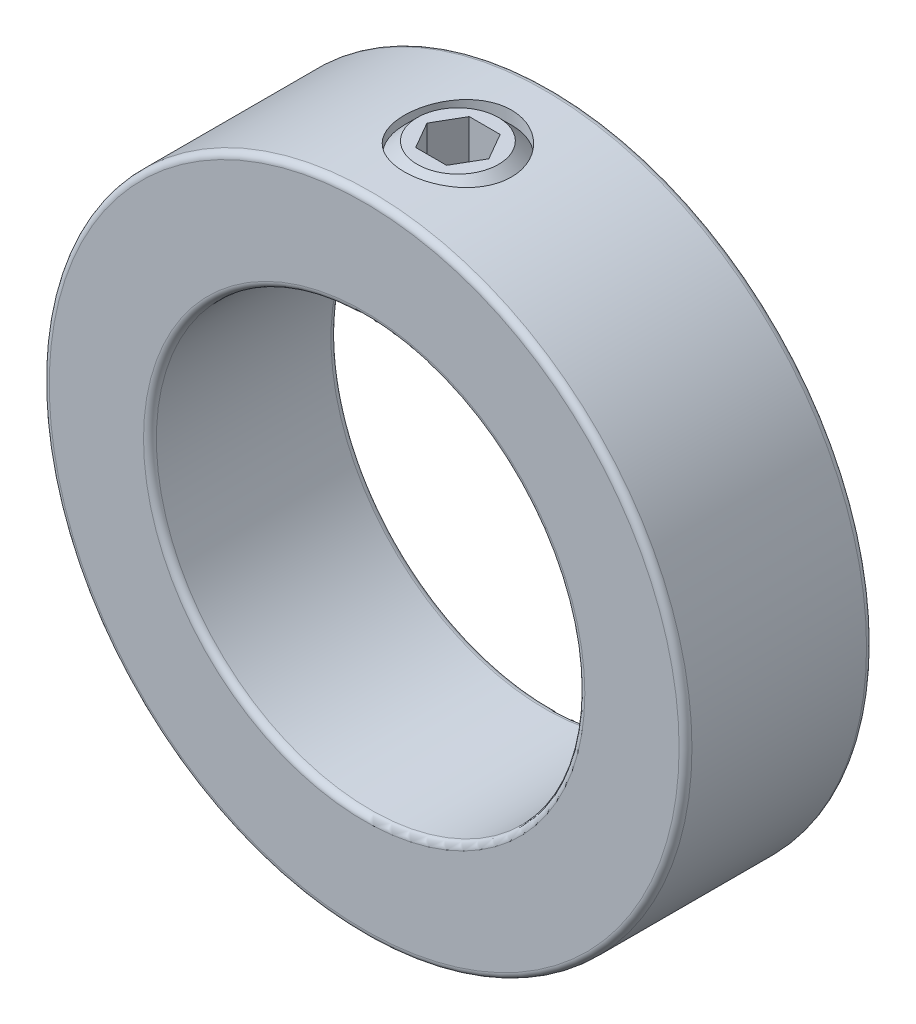
ISO-10303-21;
HEADER;
FILE_DESCRIPTION(('STEP AP214'),'2;1');
FILE_NAME('part.step','',(''),(''),'','','');
FILE_SCHEMA(('AUTOMOTIVE_DESIGN { 1 0 10303 214 1 1 1 1 }'));
ENDSEC;
DATA;
#1=APPLICATION_CONTEXT('core data for automotive mechanical design processes');
#2=APPLICATION_PROTOCOL_DEFINITION('international standard','automotive_design',2000,#1);
#3=PRODUCT_CONTEXT('',#1,'mechanical');
#4=PRODUCT('Part','Part','',(#3));
#5=PRODUCT_RELATED_PRODUCT_CATEGORY('part','',(#4));
#6=PRODUCT_DEFINITION_FORMATION('','',#4);
#7=PRODUCT_DEFINITION_CONTEXT('part definition',#1,'design');
#8=PRODUCT_DEFINITION('design','',#6,#7);
#9=PRODUCT_DEFINITION_SHAPE('','',#8);
#10=(LENGTH_UNIT() NAMED_UNIT(*) SI_UNIT(.MILLI.,.METRE.));
#11=(NAMED_UNIT(*) PLANE_ANGLE_UNIT() SI_UNIT($,.RADIAN.));
#12=(NAMED_UNIT(*) SI_UNIT($,.STERADIAN.) SOLID_ANGLE_UNIT());
#13=UNCERTAINTY_MEASURE_WITH_UNIT(LENGTH_MEASURE(1.E-05),#10,'distance_accuracy_value','');
#14=(GEOMETRIC_REPRESENTATION_CONTEXT(3) GLOBAL_UNCERTAINTY_ASSIGNED_CONTEXT((#13)) GLOBAL_UNIT_ASSIGNED_CONTEXT((#10,
#11,#12)) REPRESENTATION_CONTEXT('',''));
#15=CARTESIAN_POINT('',(0.,0.,0.));
#16=DIRECTION('',(0.,0.,1.));
#17=DIRECTION('',(1.,0.,0.));
#18=AXIS2_PLACEMENT_3D('',#15,#16,#17);
#19=CARTESIAN_POINT('',(0.,38.1,0.));
#20=DIRECTION('',(0.,1.,0.));
#21=DIRECTION('',(-1.,0.,0.));
#22=AXIS2_PLACEMENT_3D('',#19,#20,#21);
#23=PLANE('',#22);
#24=CARTESIAN_POINT('',(0.,38.1,0.));
#25=DIRECTION('',(0.,1.,0.));
#26=DIRECTION('',(-1.,0.,0.));
#27=AXIS2_PLACEMENT_3D('',#24,#25,#26);
#28=CIRCLE('',#27,4.81638526248807);
#29=CARTESIAN_POINT('',(-4.81638526248807,38.1,0.));
#30=VERTEX_POINT('',#29);
#31=EDGE_CURVE('E121',#30,#30,#28,.T.);
#32=ORIENTED_EDGE('',*,*,#31,.T.);
#33=EDGE_LOOP('',(#32));
#34=FACE_BOUND('',#33,.T.);
#35=DIRECTION('',(1.,0.,0.));
#36=VECTOR('',#35,1.);
#37=CARTESIAN_POINT('',(-1.83308710467706,38.1,-3.175));
#38=LINE('',#37,#36);
#39=CARTESIAN_POINT('',(-1.83308710467706,38.1,-3.175));
#40=VERTEX_POINT('',#39);
#41=CARTESIAN_POINT('',(1.83308710467706,38.1,-3.175));
#42=VERTEX_POINT('',#41);
#43=EDGE_CURVE('E116',#40,#42,#38,.T.);
#44=ORIENTED_EDGE('',*,*,#43,.T.);
#45=DIRECTION('',(0.5,0.,0.866025403784438));
#46=VECTOR('',#45,1.);
#47=CARTESIAN_POINT('',(1.83308710467706,38.1,-3.175));
#48=LINE('',#47,#46);
#49=CARTESIAN_POINT('',(3.66617420935412,38.1,0.));
#50=VERTEX_POINT('',#49);
#51=EDGE_CURVE('E62',#42,#50,#48,.T.);
#52=ORIENTED_EDGE('',*,*,#51,.T.);
#53=DIRECTION('',(-0.5,0.,0.866025403784439));
#54=VECTOR('',#53,1.);
#55=CARTESIAN_POINT('',(3.66617420935412,38.1,0.));
#56=LINE('',#55,#54);
#57=CARTESIAN_POINT('',(1.83308710467706,38.1,3.175));
#58=VERTEX_POINT('',#57);
#59=EDGE_CURVE('E120',#50,#58,#56,.T.);
#60=ORIENTED_EDGE('',*,*,#59,.T.);
#61=DIRECTION('',(-1.,0.,0.));
#62=VECTOR('',#61,1.);
#63=CARTESIAN_POINT('',(1.83308710467706,38.1,3.175));
#64=LINE('',#63,#62);
#65=CARTESIAN_POINT('',(-1.83308710467706,38.1,3.175));
#66=VERTEX_POINT('',#65);
#67=EDGE_CURVE('E244',#58,#66,#64,.T.);
#68=ORIENTED_EDGE('',*,*,#67,.T.);
#69=DIRECTION('',(-0.5,0.,-0.866025403784439));
#70=VECTOR('',#69,1.);
#71=CARTESIAN_POINT('',(-1.83308710467706,38.1,3.175));
#72=LINE('',#71,#70);
#73=CARTESIAN_POINT('',(-3.66617420935412,38.1,0.));
#74=VERTEX_POINT('',#73);
#75=EDGE_CURVE('E241',#66,#74,#72,.T.);
#76=ORIENTED_EDGE('',*,*,#75,.T.);
#77=DIRECTION('',(0.5,0.,-0.866025403784439));
#78=VECTOR('',#77,1.);
#79=CARTESIAN_POINT('',(-3.66617420935412,38.1,0.));
#80=LINE('',#79,#78);
#81=EDGE_CURVE('E235',#74,#40,#80,.T.);
#82=ORIENTED_EDGE('',*,*,#81,.T.);
#83=EDGE_LOOP('',(#44,#52,#60,#68,#76,#82));
#84=FACE_BOUND('',#83,.T.);
#85=ADVANCED_FACE('F47',(#34,#84),#23,.T.);
#86=CARTESIAN_POINT('',(0.,25.4,0.));
#87=DIRECTION('',(0.,-1.,0.));
#88=DIRECTION('',(1.,0.,0.));
#89=AXIS2_PLACEMENT_3D('',#86,#87,#88);
#90=CONICAL_SURFACE('',#89,1.84033768501431,0.785398163397448);
#91=CARTESIAN_POINT('',(0.,27.2403376850143,0.));
#92=VERTEX_POINT('',#91);
#93=VERTEX_LOOP('',#92);
#94=FACE_BOUND('',#93,.T.);
#95=CARTESIAN_POINT('',(0.,25.4,0.));
#96=DIRECTION('',(0.,1.,0.));
#97=DIRECTION('',(-1.,0.,0.));
#98=AXIS2_PLACEMENT_3D('',#95,#96,#97);
#99=CIRCLE('',#98,1.84033768501431);
#100=CARTESIAN_POINT('',(-1.84033768501431,25.4,0.));
#101=VERTEX_POINT('',#100);
#102=EDGE_CURVE('E12',#101,#101,#99,.T.);
#103=ORIENTED_EDGE('',*,*,#102,.F.);
#104=EDGE_LOOP('',(#103));
#105=FACE_BOUND('',#104,.T.);
#106=ADVANCED_FACE('F49',(#94,#105),#90,.F.);
#107=CARTESIAN_POINT('',(-4.81638526248807,25.4,0.));
#108=DIRECTION('',(0.,-1.,0.));
#109=DIRECTION('',(1.,0.,0.));
#110=AXIS2_PLACEMENT_3D('',#107,#108,#109);
#111=PLANE('',#110);
#112=ORIENTED_EDGE('',*,*,#102,.T.);
#113=EDGE_LOOP('',(#112));
#114=FACE_BOUND('',#113,.T.);
#115=CARTESIAN_POINT('',(0.,25.4,0.));
#116=DIRECTION('',(0.,1.,0.));
#117=DIRECTION('',(-1.,0.,0.));
#118=AXIS2_PLACEMENT_3D('',#115,#116,#117);
#119=CIRCLE('',#118,4.81638526248807);
#120=CARTESIAN_POINT('',(-4.81638526248807,25.4,0.));
#121=VERTEX_POINT('',#120);
#122=EDGE_CURVE('E55',#121,#121,#119,.T.);
#123=ORIENTED_EDGE('',*,*,#122,.F.);
#124=EDGE_LOOP('',(#123));
#125=FACE_BOUND('',#124,.T.);
#126=ADVANCED_FACE('F141',(#114,#125),#111,.T.);
#127=CARTESIAN_POINT('',(0.,26.9336147375119,0.));
#128=DIRECTION('',(0.,1.,0.));
#129=DIRECTION('',(-1.,0.,0.));
#130=AXIS2_PLACEMENT_3D('',#127,#128,#129);
#131=CONICAL_SURFACE('',#130,6.35,0.785398163397448);
#132=ORIENTED_EDGE('',*,*,#122,.T.);
#133=EDGE_LOOP('',(#132));
#134=FACE_BOUND('',#133,.T.);
#135=CARTESIAN_POINT('',(0.,26.9336147375119,0.));
#136=DIRECTION('',(0.,1.,0.));
#137=DIRECTION('',(-1.,0.,0.));
#138=AXIS2_PLACEMENT_3D('',#135,#136,#137);
#139=CIRCLE('',#138,6.35);
#140=CARTESIAN_POINT('',(-6.35,26.9336147375119,0.));
#141=VERTEX_POINT('',#140);
#142=EDGE_CURVE('E133',#141,#141,#139,.T.);
#143=ORIENTED_EDGE('',*,*,#142,.F.);
#144=EDGE_LOOP('',(#143));
#145=FACE_BOUND('',#144,.T.);
#146=ADVANCED_FACE('F138',(#134,#145),#131,.T.);
#147=CARTESIAN_POINT('',(0.,25.4,0.));
#148=DIRECTION('',(0.,1.,0.));
#149=DIRECTION('',(-1.,0.,0.));
#150=AXIS2_PLACEMENT_3D('',#147,#148,#149);
#151=CYLINDRICAL_SURFACE('',#150,6.35);
#152=ORIENTED_EDGE('',*,*,#142,.T.);
#153=EDGE_LOOP('',(#152));
#154=FACE_BOUND('',#153,.T.);
#155=CARTESIAN_POINT('',(0.,36.5663852624881,0.));
#156=DIRECTION('',(0.,1.,0.));
#157=DIRECTION('',(-1.,0.,0.));
#158=AXIS2_PLACEMENT_3D('',#155,#156,#157);
#159=CIRCLE('',#158,6.35);
#160=CARTESIAN_POINT('',(-6.35,36.5663852624881,0.));
#161=VERTEX_POINT('',#160);
#162=EDGE_CURVE('E125',#161,#161,#159,.T.);
#163=ORIENTED_EDGE('',*,*,#162,.F.);
#164=EDGE_LOOP('',(#163));
#165=FACE_BOUND('',#164,.T.);
#166=ADVANCED_FACE('F148',(#154,#165),#151,.T.);
#167=CARTESIAN_POINT('',(0.,38.1,0.));
#168=DIRECTION('',(0.,-1.,0.));
#169=DIRECTION('',(1.,0.,0.));
#170=AXIS2_PLACEMENT_3D('',#167,#168,#169);
#171=CONICAL_SURFACE('',#170,4.81638526248807,0.785398163397448);
#172=ORIENTED_EDGE('',*,*,#162,.T.);
#173=EDGE_LOOP('',(#172));
#174=FACE_BOUND('',#173,.T.);
#175=ORIENTED_EDGE('',*,*,#31,.F.);
#176=EDGE_LOOP('',(#175));
#177=FACE_BOUND('',#176,.T.);
#178=ADVANCED_FACE('F161',(#174,#177),#171,.T.);
#179=CARTESIAN_POINT('',(1.83308710467706,31.75,-3.175));
#180=DIRECTION('',(-0.866025403784438,0.,0.5));
#181=DIRECTION('',(0.5,0.,0.866025403784439));
#182=AXIS2_PLACEMENT_3D('',#179,#180,#181);
#183=PLANE('',#182);
#184=ORIENTED_EDGE('',*,*,#51,.F.);
#185=DIRECTION('',(0.,1.,0.));
#186=VECTOR('',#185,1.);
#187=CARTESIAN_POINT('',(1.83308710467706,31.75,-3.175));
#188=LINE('',#187,#186);
#189=CARTESIAN_POINT('',(1.83308710467706,31.75,-3.175));
#190=VERTEX_POINT('',#189);
#191=EDGE_CURVE('E115',#190,#42,#188,.T.);
#192=ORIENTED_EDGE('',*,*,#191,.F.);
#193=DIRECTION('',(0.5,0.,0.866025403784438));
#194=VECTOR('',#193,1.);
#195=CARTESIAN_POINT('',(1.83308710467706,31.75,-3.175));
#196=LINE('',#195,#194);
#197=CARTESIAN_POINT('',(3.66617420935412,31.75,0.));
#198=VERTEX_POINT('',#197);
#199=EDGE_CURVE('E106',#190,#198,#196,.T.);
#200=ORIENTED_EDGE('',*,*,#199,.T.);
#201=DIRECTION('',(0.,1.,0.));
#202=VECTOR('',#201,1.);
#203=CARTESIAN_POINT('',(3.66617420935412,31.75,0.));
#204=LINE('',#203,#202);
#205=EDGE_CURVE('E114',#198,#50,#204,.T.);
#206=ORIENTED_EDGE('',*,*,#205,.T.);
#207=EDGE_LOOP('',(#184,#192,#200,#206));
#208=FACE_BOUND('',#207,.T.);
#209=ADVANCED_FACE('F113',(#208),#183,.T.);
#210=CARTESIAN_POINT('',(3.66617420935412,31.75,0.));
#211=DIRECTION('',(-0.866025403784439,0.,-0.5));
#212=DIRECTION('',(-0.5,0.,0.866025403784439));
#213=AXIS2_PLACEMENT_3D('',#210,#211,#212);
#214=PLANE('',#213);
#215=ORIENTED_EDGE('',*,*,#59,.F.);
#216=ORIENTED_EDGE('',*,*,#205,.F.);
#217=DIRECTION('',(-0.5,0.,0.866025403784439));
#218=VECTOR('',#217,1.);
#219=CARTESIAN_POINT('',(3.66617420935412,31.75,0.));
#220=LINE('',#219,#218);
#221=CARTESIAN_POINT('',(1.83308710467706,31.75,3.175));
#222=VERTEX_POINT('',#221);
#223=EDGE_CURVE('E102',#198,#222,#220,.T.);
#224=ORIENTED_EDGE('',*,*,#223,.T.);
#225=DIRECTION('',(0.,1.,0.));
#226=VECTOR('',#225,1.);
#227=CARTESIAN_POINT('',(1.83308710467706,31.75,3.175));
#228=LINE('',#227,#226);
#229=EDGE_CURVE('E122',#222,#58,#228,.T.);
#230=ORIENTED_EDGE('',*,*,#229,.T.);
#231=EDGE_LOOP('',(#215,#216,#224,#230));
#232=FACE_BOUND('',#231,.T.);
#233=ADVANCED_FACE('F118',(#232),#214,.T.);
#234=CARTESIAN_POINT('',(1.83308710467706,31.75,3.175));
#235=DIRECTION('',(0.,0.,-1.));
#236=DIRECTION('',(-1.,0.,0.));
#237=AXIS2_PLACEMENT_3D('',#234,#235,#236);
#238=PLANE('',#237);
#239=ORIENTED_EDGE('',*,*,#67,.F.);
#240=ORIENTED_EDGE('',*,*,#229,.F.);
#241=DIRECTION('',(-1.,0.,0.));
#242=VECTOR('',#241,1.);
#243=CARTESIAN_POINT('',(1.83308710467706,31.75,3.175));
#244=LINE('',#243,#242);
#245=CARTESIAN_POINT('',(-1.83308710467706,31.75,3.175));
#246=VERTEX_POINT('',#245);
#247=EDGE_CURVE('E108',#222,#246,#244,.T.);
#248=ORIENTED_EDGE('',*,*,#247,.T.);
#249=DIRECTION('',(0.,1.,0.));
#250=VECTOR('',#249,1.);
#251=CARTESIAN_POINT('',(-1.83308710467706,31.75,3.175));
#252=LINE('',#251,#250);
#253=EDGE_CURVE('E127',#246,#66,#252,.T.);
#254=ORIENTED_EDGE('',*,*,#253,.T.);
#255=EDGE_LOOP('',(#239,#240,#248,#254));
#256=FACE_BOUND('',#255,.T.);
#257=ADVANCED_FACE('F192',(#256),#238,.T.);
#258=CARTESIAN_POINT('',(-1.83308710467706,31.75,3.175));
#259=DIRECTION('',(0.866025403784439,0.,-0.5));
#260=DIRECTION('',(-0.5,0.,-0.866025403784439));
#261=AXIS2_PLACEMENT_3D('',#258,#259,#260);
#262=PLANE('',#261);
#263=ORIENTED_EDGE('',*,*,#75,.F.);
#264=ORIENTED_EDGE('',*,*,#253,.F.);
#265=DIRECTION('',(-0.5,0.,-0.866025403784439));
#266=VECTOR('',#265,1.);
#267=CARTESIAN_POINT('',(-1.83308710467706,31.75,3.175));
#268=LINE('',#267,#266);
#269=CARTESIAN_POINT('',(-3.66617420935412,31.75,0.));
#270=VERTEX_POINT('',#269);
#271=EDGE_CURVE('E260',#246,#270,#268,.T.);
#272=ORIENTED_EDGE('',*,*,#271,.T.);
#273=DIRECTION('',(0.,1.,0.));
#274=VECTOR('',#273,1.);
#275=CARTESIAN_POINT('',(-3.66617420935412,31.75,0.));
#276=LINE('',#275,#274);
#277=EDGE_CURVE('E251',#270,#74,#276,.T.);
#278=ORIENTED_EDGE('',*,*,#277,.T.);
#279=EDGE_LOOP('',(#263,#264,#272,#278));
#280=FACE_BOUND('',#279,.T.);
#281=ADVANCED_FACE('F198',(#280),#262,.T.);
#282=CARTESIAN_POINT('',(-3.66617420935412,31.75,0.));
#283=DIRECTION('',(0.866025403784439,0.,0.5));
#284=DIRECTION('',(0.5,0.,-0.866025403784439));
#285=AXIS2_PLACEMENT_3D('',#282,#283,#284);
#286=PLANE('',#285);
#287=ORIENTED_EDGE('',*,*,#81,.F.);
#288=ORIENTED_EDGE('',*,*,#277,.F.);
#289=DIRECTION('',(0.5,0.,-0.866025403784439));
#290=VECTOR('',#289,1.);
#291=CARTESIAN_POINT('',(-3.66617420935412,31.75,0.));
#292=LINE('',#291,#290);
#293=CARTESIAN_POINT('',(-1.83308710467706,31.75,-3.175));
#294=VERTEX_POINT('',#293);
#295=EDGE_CURVE('E258',#270,#294,#292,.T.);
#296=ORIENTED_EDGE('',*,*,#295,.T.);
#297=DIRECTION('',(0.,1.,0.));
#298=VECTOR('',#297,1.);
#299=CARTESIAN_POINT('',(-1.83308710467706,31.75,-3.175));
#300=LINE('',#299,#298);
#301=EDGE_CURVE('E234',#294,#40,#300,.T.);
#302=ORIENTED_EDGE('',*,*,#301,.T.);
#303=EDGE_LOOP('',(#287,#288,#296,#302));
#304=FACE_BOUND('',#303,.T.);
#305=ADVANCED_FACE('F206',(#304),#286,.T.);
#306=CARTESIAN_POINT('',(-1.83308710467706,31.75,-3.175));
#307=DIRECTION('',(0.,0.,1.));
#308=DIRECTION('',(1.,0.,0.));
#309=AXIS2_PLACEMENT_3D('',#306,#307,#308);
#310=PLANE('',#309);
#311=ORIENTED_EDGE('',*,*,#43,.F.);
#312=ORIENTED_EDGE('',*,*,#301,.F.);
#313=DIRECTION('',(1.,0.,0.));
#314=VECTOR('',#313,1.);
#315=CARTESIAN_POINT('',(-1.83308710467706,31.75,-3.175));
#316=LINE('',#315,#314);
#317=EDGE_CURVE('E249',#294,#190,#316,.T.);
#318=ORIENTED_EDGE('',*,*,#317,.T.);
#319=ORIENTED_EDGE('',*,*,#191,.T.);
#320=EDGE_LOOP('',(#311,#312,#318,#319));
#321=FACE_BOUND('',#320,.T.);
#322=ADVANCED_FACE('F214',(#321),#310,.T.);
#323=CARTESIAN_POINT('',(3.66617420935412,31.75,0.));
#324=DIRECTION('',(0.,-1.,0.));
#325=DIRECTION('',(0.,0.,-1.));
#326=AXIS2_PLACEMENT_3D('',#323,#324,#325);
#327=PLANE('',#326);
#328=ORIENTED_EDGE('',*,*,#199,.F.);
#329=ORIENTED_EDGE('',*,*,#317,.F.);
#330=ORIENTED_EDGE('',*,*,#295,.F.);
#331=ORIENTED_EDGE('',*,*,#271,.F.);
#332=ORIENTED_EDGE('',*,*,#247,.F.);
#333=ORIENTED_EDGE('',*,*,#223,.F.);
#334=EDGE_LOOP('',(#328,#329,#330,#331,#332,#333));
#335=FACE_BOUND('',#334,.T.);
#336=ADVANCED_FACE('F104',(#335),#327,.F.);
#337=CLOSED_SHELL('',(#85,#106,#126,#146,#166,#178,#209,#233,#257,#281,#305,#322,#336));
#338=MANIFOLD_SOLID_BREP('B2',#337);
#339=CARTESIAN_POINT('',(0.,0.,11.1125));
#340=DIRECTION('',(0.,0.,1.));
#341=DIRECTION('',(1.,0.,0.));
#342=AXIS2_PLACEMENT_3D('',#339,#340,#341);
#343=PLANE('',#342);
#344=CARTESIAN_POINT('',(0.,0.,11.1125));
#345=DIRECTION('',(0.,0.,1.));
#346=DIRECTION('',(1.,0.,0.));
#347=AXIS2_PLACEMENT_3D('',#344,#345,#346);
#348=CIRCLE('',#347,26.162);
#349=CARTESIAN_POINT('',(26.162,0.,11.1125));
#350=VERTEX_POINT('',#349);
#351=EDGE_CURVE('E287',#350,#350,#348,.F.);
#352=ORIENTED_EDGE('',*,*,#351,.T.);
#353=EDGE_LOOP('',(#352));
#354=FACE_BOUND('',#353,.T.);
#355=CARTESIAN_POINT('',(0.,0.,11.1125));
#356=DIRECTION('',(0.,0.,1.));
#357=DIRECTION('',(1.,0.,0.));
#358=AXIS2_PLACEMENT_3D('',#355,#356,#357);
#359=CIRCLE('',#358,37.338);
#360=CARTESIAN_POINT('',(37.338,0.,11.1125));
#361=VERTEX_POINT('',#360);
#362=EDGE_CURVE('E291',#361,#361,#359,.T.);
#363=ORIENTED_EDGE('',*,*,#362,.T.);
#364=EDGE_LOOP('',(#363));
#365=FACE_BOUND('',#364,.T.);
#366=ADVANCED_FACE('F276',(#354,#365),#343,.T.);
#367=CARTESIAN_POINT('',(0.,0.,-11.1125));
#368=DIRECTION('',(0.,0.,1.));
#369=DIRECTION('',(1.,0.,0.));
#370=AXIS2_PLACEMENT_3D('',#367,#368,#369);
#371=PLANE('',#370);
#372=CARTESIAN_POINT('',(0.,0.,-11.1125));
#373=DIRECTION('',(0.,0.,1.));
#374=DIRECTION('',(1.,0.,0.));
#375=AXIS2_PLACEMENT_3D('',#372,#373,#374);
#376=CIRCLE('',#375,26.162);
#377=CARTESIAN_POINT('',(26.162,0.,-11.1125));
#378=VERTEX_POINT('',#377);
#379=EDGE_CURVE('E302',#378,#378,#376,.T.);
#380=ORIENTED_EDGE('',*,*,#379,.T.);
#381=EDGE_LOOP('',(#380));
#382=FACE_BOUND('',#381,.T.);
#383=CARTESIAN_POINT('',(0.,0.,-11.1125));
#384=DIRECTION('',(0.,0.,1.));
#385=DIRECTION('',(1.,0.,0.));
#386=AXIS2_PLACEMENT_3D('',#383,#384,#385);
#387=CIRCLE('',#386,37.338);
#388=CARTESIAN_POINT('',(37.338,0.,-11.1125));
#389=VERTEX_POINT('',#388);
#390=EDGE_CURVE('E305',#389,#389,#387,.F.);
#391=ORIENTED_EDGE('',*,*,#390,.T.);
#392=EDGE_LOOP('',(#391));
#393=FACE_BOUND('',#392,.T.);
#394=ADVANCED_FACE('F341',(#382,#393),#371,.F.);
#395=CARTESIAN_POINT('',(0.,0.,11.1125));
#396=DIRECTION('',(0.,0.,-1.));
#397=DIRECTION('',(-1.,0.,0.));
#398=AXIS2_PLACEMENT_3D('',#395,#396,#397);
#399=CYLINDRICAL_SURFACE('',#398,38.1);
#400=CARTESIAN_POINT('',(0.,0.,-10.3505));
#401=DIRECTION('',(0.,0.,1.));
#402=DIRECTION('',(1.,0.,0.));
#403=AXIS2_PLACEMENT_3D('',#400,#401,#402);
#404=CIRCLE('',#403,38.1);
#405=CARTESIAN_POINT('',(38.1,0.,-10.3505));
#406=VERTEX_POINT('',#405);
#407=EDGE_CURVE('E46',#406,#406,#404,.T.);
#408=ORIENTED_EDGE('',*,*,#407,.T.);
#409=EDGE_LOOP('',(#408));
#410=FACE_BOUND('',#409,.T.);
#411=CARTESIAN_POINT('',(0.,0.,10.3505));
#412=DIRECTION('',(0.,0.,1.));
#413=DIRECTION('',(1.,0.,0.));
#414=AXIS2_PLACEMENT_3D('',#411,#412,#413);
#415=CIRCLE('',#414,38.1);
#416=CARTESIAN_POINT('',(38.1,0.,10.3505));
#417=VERTEX_POINT('',#416);
#418=EDGE_CURVE('E283',#417,#417,#415,.F.);
#419=ORIENTED_EDGE('',*,*,#418,.T.);
#420=EDGE_LOOP('',(#419));
#421=FACE_BOUND('',#420,.T.);
#422=CARTESIAN_POINT('',(0.,38.1,-6.35));
#423=CARTESIAN_POINT('',(0.177087187489278,38.1000011863187,-6.35000272872581));
#424=CARTESIAN_POINT('',(0.354137436244108,38.0987630708564,-6.34258986032636));
#425=CARTESIAN_POINT('',(0.707020298099036,38.0938477536353,-6.31299958695175));
#426=CARTESIAN_POINT('',(0.882852663182217,38.0901700690163,-6.29081925907261));
#427=CARTESIAN_POINT('',(1.23209116083708,38.0804739658059,-6.23184070761945));
#428=CARTESIAN_POINT('',(1.4054956913197,38.0744540706817,-6.19503326277695));
#429=CARTESIAN_POINT('',(1.74860263812475,38.0602401477359,-6.10706670963457));
#430=CARTESIAN_POINT('',(1.91830367136937,38.0520453222257,-6.05590233531819));
#431=CARTESIAN_POINT('',(2.25254220668841,38.0337223659018,-5.9396820482716));
#432=CARTESIAN_POINT('',(2.41708564982888,38.0235965624201,-5.87464284723924));
#433=CARTESIAN_POINT('',(2.74014193111762,38.0016821525234,-5.73108865416497));
#434=CARTESIAN_POINT('',(2.89865252044299,37.98989293361,-5.65256869595593));
#435=CARTESIAN_POINT('',(3.20841653485805,37.9649864854272,-5.48267748727417));
#436=CARTESIAN_POINT('',(3.35967352134211,37.9518699179091,-5.39131263188384));
#437=CARTESIAN_POINT('',(3.65404496448426,37.9246597405346,-5.19631000052296));
#438=CARTESIAN_POINT('',(3.79715636428495,37.9105657682245,-5.09266766146105));
#439=CARTESIAN_POINT('',(4.07534808906753,37.8816744348182,-4.87295704139125));
#440=CARTESIAN_POINT('',(4.21035302453209,37.8668722576236,-4.75679392765042));
#441=CARTESIAN_POINT('',(4.4701701945329,37.8370808534961,-4.51350901496518));
#442=CARTESIAN_POINT('',(4.59497863698451,37.822091559342,-4.38638317477703));
#443=CARTESIAN_POINT('',(4.83345363594854,37.7923559025335,-4.12212226847573));
#444=CARTESIAN_POINT('',(4.94712356668848,37.7776094674422,-3.9849902556656));
#445=CARTESIAN_POINT('',(5.16261513533891,37.7487646238876,-3.70156836191072));
#446=CARTESIAN_POINT('',(5.26443238791663,37.7346664564344,-3.55527512202769));
#447=CARTESIAN_POINT('',(5.45600638335986,37.7074450790141,-3.25370377286055));
#448=CARTESIAN_POINT('',(5.54568970289747,37.6943280021243,-3.0983784466417));
#449=CARTESIAN_POINT('',(5.71167137591972,37.6695348337581,-2.78055185995428));
#450=CARTESIAN_POINT('',(5.78796472928632,37.6578592810601,-2.61804794707143));
#451=CARTESIAN_POINT('',(5.92652810623005,37.6363015667466,-2.28711847501249));
#452=CARTESIAN_POINT('',(5.98880405333041,37.6264186479379,-2.11869545207257));
#453=CARTESIAN_POINT('',(6.09891747906052,37.6087259862464,-1.77706996663889));
#454=CARTESIAN_POINT('',(6.14674968619303,37.600917000407,-1.60386578428706));
#455=CARTESIAN_POINT('',(6.26716384053575,37.581106953425,-1.08229212566174));
#456=CARTESIAN_POINT('',(6.31810213845207,37.5724910212383,-0.728511540990053));
#457=CARTESIAN_POINT('',(6.35996687648436,37.5654259452238,-0.0175219888652936));
#458=CARTESIAN_POINT('',(6.35089756366378,37.5669760818881,0.339686734173062));
#459=CARTESIAN_POINT('',(6.27352869541675,37.5799723761781,1.04374248778809));
#460=CARTESIAN_POINT('',(6.20584069900666,37.5913163525528,1.39065837404938));
#461=CARTESIAN_POINT('',(6.01409427766273,37.6224668880973,2.06812597437278));
#462=CARTESIAN_POINT('',(5.89003391937083,37.6422737375101,2.39867712675541));
#463=CARTESIAN_POINT('',(5.58844985400104,37.6882274534117,3.0358801788231));
#464=CARTESIAN_POINT('',(5.41067212714135,37.7144043255227,3.34240961460723));
#465=CARTESIAN_POINT('',(5.0068786187166,37.7701281067429,3.92151745422894));
#466=CARTESIAN_POINT('',(4.78085894382577,37.7996752877603,4.19409311504239));
#467=CARTESIAN_POINT('',(4.2836647932058,37.8592595138752,4.70109818241926));
#468=CARTESIAN_POINT('',(4.01196546135645,37.8892980920187,4.93501301685999));
#469=CARTESIAN_POINT('',(3.43289953929472,37.946142073942,5.35400953740192));
#470=CARTESIAN_POINT('',(3.12553271928923,37.9729474568892,5.5390909088611));
#471=CARTESIAN_POINT('',(2.48337302521498,38.0203428798906,5.85521365152593));
#472=CARTESIAN_POINT('',(2.14855736243015,38.0409276876551,5.98620956375732));
#473=CARTESIAN_POINT('',(1.46125779833498,38.0735205764156,6.18996530806875));
#474=CARTESIAN_POINT('',(1.10877537768379,38.0855293748888,6.26273001188952));
#475=CARTESIAN_POINT('',(0.400583149140156,38.0995206980173,6.34726025051473));
#476=CARTESIAN_POINT('',(0.0449598721958704,38.1016193264734,6.35973219379204));
#477=CARTESIAN_POINT('',(-0.663295022972625,38.0958718503491,6.32520618374683));
#478=CARTESIAN_POINT('',(-1.01592675578099,38.0880261284112,6.27821051864089));
#479=CARTESIAN_POINT('',(-1.70600668639052,38.063343404013,6.12667088825345));
#480=CARTESIAN_POINT('',(-2.04353380753409,38.0465610611375,6.02247665149521));
#481=CARTESIAN_POINT('',(-2.69632908571019,38.0058793979819,5.75987030296589));
#482=CARTESIAN_POINT('',(-3.01159599157095,37.9819796780514,5.60145514654107));
#483=CARTESIAN_POINT('',(-3.61398995815132,37.9294267110082,5.23328622162175));
#484=CARTESIAN_POINT('',(-3.90084376323507,37.9007333280144,5.02309119694951));
#485=CARTESIAN_POINT('',(-4.43545868132024,37.8418970832711,4.55793492528629));
#486=CARTESIAN_POINT('',(-4.68321695230037,37.8117541163526,4.30297042665492));
#487=CARTESIAN_POINT('',(-5.13522675786021,37.7530404075497,3.7523493354767));
#488=CARTESIAN_POINT('',(-5.33900101896994,37.7244891869762,3.45629857310199));
#489=CARTESIAN_POINT('',(-5.69392350241975,37.6725570192594,2.8337393050112));
#490=CARTESIAN_POINT('',(-5.8450733929432,37.6491759082333,2.50723176518576));
#491=CARTESIAN_POINT('',(-6.08974872162488,37.6103751182998,1.8344295197639));
#492=CARTESIAN_POINT('',(-6.18351170337908,37.5949226636084,1.48822295551794));
#493=CARTESIAN_POINT('',(-6.31147698831455,37.5736562611202,0.784497359945579));
#494=CARTESIAN_POINT('',(-6.34568446957212,37.5678414753746,0.426979314852599));
#495=CARTESIAN_POINT('',(-6.35156479805326,37.566839453881,-0.107200424943623));
#496=CARTESIAN_POINT('',(-6.3461134925206,37.5677648877224,-0.283891890974141));
#497=CARTESIAN_POINT('',(-6.32051614738165,37.5720813559984,-0.63615898229896));
#498=CARTESIAN_POINT('',(-6.30037562911679,37.5754714640165,-0.811735001858511));
#499=CARTESIAN_POINT('',(-6.24553793473015,37.5846246847688,-1.16058669238111));
#500=CARTESIAN_POINT('',(-6.21083556002646,37.5903886449545,-1.3338615190051));
#501=CARTESIAN_POINT('',(-6.12715693228831,37.604118742639,-1.67677649769051));
#502=CARTESIAN_POINT('',(-6.0781858174276,37.6120840873662,-1.84641793457066));
#503=CARTESIAN_POINT('',(-5.96637654372831,37.6299820560965,-2.18080412850474));
#504=CARTESIAN_POINT('',(-5.90354973294343,37.6399130695049,-2.34555276827213));
#505=CARTESIAN_POINT('',(-5.76449173077207,37.6614601477677,-2.66910658257644));
#506=CARTESIAN_POINT('',(-5.68826534098594,37.6730756087577,-2.82791386149802));
#507=CARTESIAN_POINT('',(-5.52290613124229,37.6976722605729,-3.13862904251533));
#508=CARTESIAN_POINT('',(-5.43376825184751,37.7106539862286,-3.29053420918424));
#509=CARTESIAN_POINT('',(-5.24326758944333,37.7376124328875,-3.58630413755221));
#510=CARTESIAN_POINT('',(-5.14190910346795,37.7515888034474,-3.73017169956176));
#511=CARTESIAN_POINT('',(-4.92632600417356,37.7803292409247,-4.01067104735172));
#512=CARTESIAN_POINT('',(-4.81195911510494,37.7951008544654,-4.14719273443224));
#513=CARTESIAN_POINT('',(-4.57222320121723,37.824851025054,-4.4100920135284));
#514=CARTESIAN_POINT('',(-4.44685811987933,37.8398295063179,-4.53647321062227));
#515=CARTESIAN_POINT('',(-4.18587205978365,37.869588465624,-4.77835205107128));
#516=CARTESIAN_POINT('',(-4.05024500803611,37.8843688202287,-4.89384315746954));
#517=CARTESIAN_POINT('',(-3.76978048024299,37.9133039762987,-5.11301455945322));
#518=CARTESIAN_POINT('',(-3.62494642226589,37.9274590066437,-5.21669919870492));
#519=CARTESIAN_POINT('',(-3.32592456844756,37.9548537782111,-5.41228918862145));
#520=CARTESIAN_POINT('',(-3.17167621479995,37.9680860844735,-5.504103036644));
#521=CARTESIAN_POINT('',(-2.85593164400635,37.9931404953123,-5.67435586892611));
#522=CARTESIAN_POINT('',(-2.69443812110207,38.0049631182187,-5.75279977379904));
#523=CARTESIAN_POINT('',(-2.36539813222964,38.026859543709,-5.89572189696043));
#524=CARTESIAN_POINT('',(-2.19785596261659,38.0369345592008,-5.96020980901386));
#525=CARTESIAN_POINT('',(-1.85787010097684,38.05505638655,-6.07478441999711));
#526=CARTESIAN_POINT('',(-1.68542746934926,38.0631036335282,-6.1248742088173));
#527=CARTESIAN_POINT('',(-1.26427501955242,38.0798175597504,-6.22805244248603));
#528=CARTESIAN_POINT('',(-1.01366559672306,38.0873506266376,-6.27372844443033));
#529=CARTESIAN_POINT('',(-0.508678681414364,38.0974409521383,-6.33470000240438));
#530=CARTESIAN_POINT('',(-0.254301253884982,38.0999982964193,-6.34999608148728));
#531=CARTESIAN_POINT('',(0.,38.1,-6.35));
#532=B_SPLINE_CURVE_WITH_KNOTS('',3,(#422,#423,#424,#425,#426,#427,#428,#429,#430,#431,#432,
#433,#434,#435,#436,#437,#438,#439,#440,#441,#442,#443,#444,#445,#446,#447,#448,#449,#450,#451,
#452,#453,#454,#455,#456,#457,#458,#459,#460,#461,#462,#463,#464,#465,#466,#467,#468,#469,#470,
#471,#472,#473,#474,#475,#476,#477,#478,#479,#480,#481,#482,#483,#484,#485,#486,#487,#488,#489,
#490,#491,#492,#493,#494,#495,#496,#497,#498,#499,#500,#501,#502,#503,#504,#505,#506,#507,#508,
#509,#510,#511,#512,#513,#514,#515,#516,#517,#518,#519,#520,#521,#522,#523,#524,#525,#526,#527,
#528,#529,#530,#531),.UNSPECIFIED.,.T.,.F.,(4,2,2,2,2,2,2,2,2,2,2,2,2,2,2,2,2,2,2,2,2,2,2,2,2,2,
2,2,2,2,2,2,2,2,2,2,2,2,2,2,2,2,2,2,2,2,2,2,2,2,2,2,2,2,4),(0.,0.531038660598125,
1.06218246024441,1.59366163761647,2.12533601304965,2.65637358661449,3.1876072101753,
3.71857727922958,4.24974531326047,4.78526441519898,5.3209817790362,5.85653635119168,
6.39228844582579,6.93114981384536,7.47021197879169,8.00904591554079,8.54807627219621,
9.61504645798446,10.6819411293247,11.7378373522885,12.7937697912188,13.8547758380411,
14.9158675448607,15.9901084553218,17.0643562871247,18.1395051980381,19.2145641504113,
20.2769963402556,21.339387650685,22.3953543975371,23.4513804495562,24.5167374705005,
25.5821719011529,26.6586431785677,27.7350803289231,28.807031067069,29.8788885993829,
30.4087059677912,30.9383242924513,31.4681318518971,31.9977488629147,32.5269337088015,
33.0559293119034,33.5851327684116,34.1141506850706,34.6496427436838,35.1849435764207,
35.720563713634,36.2559861520879,36.795316710381,37.3344483452647,37.8732042913802,
38.4118445320141,39.1744413312763,39.9370250007452),.UNSPECIFIED.);
#533=CARTESIAN_POINT('',(0.,38.1,-6.35));
#534=VERTEX_POINT('',#533);
#535=EDGE_CURVE('E308',#534,#534,#532,.T.);
#536=ORIENTED_EDGE('',*,*,#535,.T.);
#537=EDGE_LOOP('',(#536));
#538=FACE_BOUND('',#537,.T.);
#539=ADVANCED_FACE('F338',(#410,#421,#538),#399,.T.);
#540=CARTESIAN_POINT('',(0.,0.,11.1125));
#541=DIRECTION('',(0.,0.,-1.));
#542=DIRECTION('',(-1.,0.,0.));
#543=AXIS2_PLACEMENT_3D('',#540,#541,#542);
#544=CYLINDRICAL_SURFACE('',#543,25.4);
#545=CARTESIAN_POINT('',(0.,0.,-10.3505));
#546=DIRECTION('',(0.,0.,1.));
#547=DIRECTION('',(1.,0.,0.));
#548=AXIS2_PLACEMENT_3D('',#545,#546,#547);
#549=CIRCLE('',#548,25.4);
#550=CARTESIAN_POINT('',(25.4,0.,-10.3505));
#551=VERTEX_POINT('',#550);
#552=EDGE_CURVE('E296',#551,#551,#549,.F.);
#553=ORIENTED_EDGE('',*,*,#552,.T.);
#554=EDGE_LOOP('',(#553));
#555=FACE_BOUND('',#554,.T.);
#556=CARTESIAN_POINT('',(0.,0.,10.3505));
#557=DIRECTION('',(0.,0.,1.));
#558=DIRECTION('',(1.,0.,0.));
#559=AXIS2_PLACEMENT_3D('',#556,#557,#558);
#560=CIRCLE('',#559,25.4);
#561=CARTESIAN_POINT('',(25.4,0.,10.3505));
#562=VERTEX_POINT('',#561);
#563=EDGE_CURVE('E299',#562,#562,#560,.T.);
#564=ORIENTED_EDGE('',*,*,#563,.T.);
#565=EDGE_LOOP('',(#564));
#566=FACE_BOUND('',#565,.T.);
#567=CARTESIAN_POINT('',(0.,25.4,-6.35));
#568=CARTESIAN_POINT('',(0.175477368335688,25.4000031710595,-6.35000523766371));
#569=CARTESIAN_POINT('',(0.350897420818032,25.3981788556915,-6.34272514907218));
#570=CARTESIAN_POINT('',(0.700509078087221,25.3909395099852,-6.31367814603267));
#571=CARTESIAN_POINT('',(0.874700540422952,25.3855240699658,-6.29190957871583));
#572=CARTESIAN_POINT('',(1.22059137272975,25.3712464324763,-6.23405353030644));
#573=CARTESIAN_POINT('',(1.3922899524397,25.3623831657437,-6.19796160709105));
#574=CARTESIAN_POINT('',(1.7319942431567,25.3414514847781,-6.11174384297621));
#575=CARTESIAN_POINT('',(1.89999856846247,25.3293818893422,-6.06161282974398));
#576=CARTESIAN_POINT('',(2.23081734458719,25.3023903485221,-5.94781513183051));
#577=CARTESIAN_POINT('',(2.39363964336374,25.2874729817979,-5.88417015676711));
#578=CARTESIAN_POINT('',(2.71334043544166,25.2551699495027,-5.74375977418831));
#579=CARTESIAN_POINT('',(2.87021670804384,25.2377833730272,-5.66698952254887));
#580=CARTESIAN_POINT('',(3.17688024593829,25.2010173505744,-5.50093859473842));
#581=CARTESIAN_POINT('',(3.32667006425748,25.1816386304114,-5.41166247066776));
#582=CARTESIAN_POINT('',(3.61832024042658,25.141388997849,-5.22116921580858));
#583=CARTESIAN_POINT('',(3.76017758815661,25.1205175257531,-5.11994759679996));
#584=CARTESIAN_POINT('',(4.03750393287548,25.0774522474359,-4.9043315709111));
#585=CARTESIAN_POINT('',(4.17281051933205,25.0552413295654,-4.78973164421147));
#586=CARTESIAN_POINT('',(4.43338729824145,25.010449109414,-4.54961303995722));
#587=CARTESIAN_POINT('',(4.55865374829686,24.9878676727682,-4.42409032702951));
#588=CARTESIAN_POINT('',(4.79824509746213,24.942968931678,-4.16301884850913));
#589=CARTESIAN_POINT('',(4.91257275871294,24.9206515618085,-4.027472629348));
#590=CARTESIAN_POINT('',(5.12959684750453,24.8768868272122,-3.74715466750171));
#591=CARTESIAN_POINT('',(5.23228896555895,24.8554397867069,-3.60237953750122));
#592=CARTESIAN_POINT('',(5.42668438129291,24.8137286118806,-3.30242268356553));
#593=CARTESIAN_POINT('',(5.51820639937681,24.7934861842616,-3.14712034723526));
#594=CARTESIAN_POINT('',(5.68784421693557,24.755120552848,-2.829034737391));
#595=CARTESIAN_POINT('',(5.76595494567319,24.7369981514456,-2.6662486636776));
#596=CARTESIAN_POINT('',(5.9080803961254,24.7034397392096,-2.33444117618976));
#597=CARTESIAN_POINT('',(5.97210210939067,24.68800239674,-2.16542290392964));
#598=CARTESIAN_POINT('',(6.08558870998768,24.6602710489484,-1.82231983655754));
#599=CARTESIAN_POINT('',(6.13504838447488,24.6479781694714,-1.64823325156305));
#600=CARTESIAN_POINT('',(6.25914374825844,24.6168789520224,-1.12731370869374));
#601=CARTESIAN_POINT('',(6.31252426947526,24.6031101485883,-0.774717338597171));
#602=CARTESIAN_POINT('',(6.34783939503414,24.5940009437438,-0.243259555643463));
#603=CARTESIAN_POINT('',(6.35214485658127,24.5928903401882,-0.0656108699974871));
#604=CARTESIAN_POINT('',(6.34588277430792,24.5945073780102,0.289428395353652));
#605=CARTESIAN_POINT('',(6.33531508337368,24.5972350573532,0.466818972488431));
#606=CARTESIAN_POINT('',(6.282210717607,24.6108806382161,0.987928514542095));
#607=CARTESIAN_POINT('',(6.21884460073213,24.6271165712381,1.32961828201516));
#608=CARTESIAN_POINT('',(6.03768209721243,24.6721486694925,1.99717496831828));
#609=CARTESIAN_POINT('',(5.91988183292792,24.7009457295138,2.32304075809273));
#610=CARTESIAN_POINT('',(5.63198220323522,24.7681803767332,2.95374313898633));
#611=CARTESIAN_POINT('',(5.46136691279107,24.8067123450231,3.25833424798368));
#612=CARTESIAN_POINT('',(5.07304154695446,24.8890242769867,3.83505975124196));
#613=CARTESIAN_POINT('',(4.8553232305771,24.9328051583941,4.10718845304936));
#614=CARTESIAN_POINT('',(4.37160850403657,25.0222123177803,4.61942755685228));
#615=CARTESIAN_POINT('',(4.10441249538153,25.0678556192047,4.85840371884657));
#616=CARTESIAN_POINT('',(3.5331904482862,25.1547191981977,5.28837021551917));
#617=CARTESIAN_POINT('',(3.22916328526542,25.1959393406395,5.47935908443449));
#618=CARTESIAN_POINT('',(2.5912905991288,25.2695173289519,5.80834740804578));
#619=CARTESIAN_POINT('',(2.25734624362243,25.3018442485759,5.94616260309935));
#620=CARTESIAN_POINT('',(1.57004175543464,25.3537684828018,6.16338326481416));
#621=CARTESIAN_POINT('',(1.21668535063703,25.3733682323211,6.2427999044672));
#622=CARTESIAN_POINT('',(0.510285919246607,25.3972694779652,6.33923708375869));
#623=CARTESIAN_POINT('',(0.15746627897107,25.4019496302995,6.35780236952216));
#624=CARTESIAN_POINT('',(-0.546239334332569,25.3965627053655,6.33624566551539));
#625=CARTESIAN_POINT('',(-0.897125478569811,25.3864969556011,6.29612895860826));
#626=CARTESIAN_POINT('',(-1.58163313415953,25.3529923842754,6.15962398880225));
#627=CARTESIAN_POINT('',(-1.91543343305329,25.3297539457695,6.06407841138208));
#628=CARTESIAN_POINT('',(-2.56225810885605,25.2725214822312,5.82037691719912));
#629=CARTESIAN_POINT('',(-2.87528038380228,25.2385263710238,5.67221568728842));
#630=CARTESIAN_POINT('',(-3.47777277441651,25.1626516754406,5.32454546700769));
#631=CARTESIAN_POINT('',(-3.76672640787545,25.1206428888929,5.12417198683214));
#632=CARTESIAN_POINT('',(-4.30756129917306,25.0335780508423,4.67867851581441));
#633=CARTESIAN_POINT('',(-4.55943614542403,24.9885214742832,4.43355080254059));
#634=CARTESIAN_POINT('',(-4.90717834470799,24.9217589766669,4.03415804714469));
#635=CARTESIAN_POINT('',(-5.01926866160509,24.8993709370079,3.89380570147791));
#636=CARTESIAN_POINT('',(-5.23122685203936,24.8557025906451,3.60401676644391));
#637=CARTESIAN_POINT('',(-5.33109917644899,24.8344218821867,3.45458351501539));
#638=CARTESIAN_POINT('',(-5.51793758808666,24.7935782927896,3.14756774776995));
#639=CARTESIAN_POINT('',(-5.6048989801736,24.7740160378282,2.98998229530885));
#640=CARTESIAN_POINT('',(-5.76519514981392,24.7372045033632,2.66784056206427));
#641=CARTESIAN_POINT('',(-5.83853539673374,24.7199542962693,2.50328711191059));
#642=CARTESIAN_POINT('',(-5.97067425881327,24.688370583311,2.1692462826691));
#643=CARTESIAN_POINT('',(-6.02955222433233,24.6740212417776,1.999791801299));
#644=CARTESIAN_POINT('',(-6.1327931149458,24.6485634010713,1.65634767282773));
#645=CARTESIAN_POINT('',(-6.17716162483007,24.6374536551344,1.48235979856802));
#646=CARTESIAN_POINT('',(-6.25103277930087,24.6188148175501,1.13106398129011));
#647=CARTESIAN_POINT('',(-6.28053528947479,24.611285758278,0.953756008267878));
#648=CARTESIAN_POINT('',(-6.32441063496973,24.6000476746204,0.597159283401967));
#649=CARTESIAN_POINT('',(-6.33878385299868,24.5963385536064,0.417870581778383));
#650=CARTESIAN_POINT('',(-6.35207673174978,24.5929088263029,0.063880920440012));
#651=CARTESIAN_POINT('',(-6.35143127769379,24.5930759770304,-0.11080276982903));
#652=CARTESIAN_POINT('',(-6.33575561126539,24.5971190708759,-0.459538222261958));
#653=CARTESIAN_POINT('',(-6.32072072481372,24.600996219102,-0.633589760644836));
#654=CARTESIAN_POINT('',(-6.27639249176991,24.6123428121949,-0.979710772256714));
#655=CARTESIAN_POINT('',(-6.24710205880485,24.6198115229946,-1.15178064315646));
#656=CARTESIAN_POINT('',(-6.17450899931628,24.6381175720356,-1.49275688177854));
#657=CARTESIAN_POINT('',(-6.13120615727164,24.6489549620895,-1.66166320080086));
#658=CARTESIAN_POINT('',(-6.03123267697015,24.6736066272614,-1.99416538127911));
#659=CARTESIAN_POINT('',(-5.97464151000921,24.6874031641975,-2.15778647746778));
#660=CARTESIAN_POINT('',(-5.84841340880726,24.7176104719978,-2.47960205373371));
#661=CARTESIAN_POINT('',(-5.77878072548573,24.7340203907627,-2.63779828223957));
#662=CARTESIAN_POINT('',(-5.62693434232341,24.7690064248437,-2.94786764032805));
#663=CARTESIAN_POINT('',(-5.54471511810796,24.7875834904888,-3.09973795598051));
#664=CARTESIAN_POINT('',(-5.36832253298904,24.8263823783131,-3.39607679107298));
#665=CARTESIAN_POINT('',(-5.27415309205695,24.84660366037,-3.54054771598495));
#666=CARTESIAN_POINT('',(-5.07182215593831,24.888703750471,-3.82496766883743));
#667=CARTESIAN_POINT('',(-4.96335638560902,24.9106122575543,-3.96469593061278));
#668=CARTESIAN_POINT('',(-4.73524098654736,24.9549791760033,-4.23452409422063));
#669=CARTESIAN_POINT('',(-4.61559517011177,24.9774373980069,-4.36462725121095));
#670=CARTESIAN_POINT('',(-4.3657987735358,25.0223082296508,-4.61449090365563));
#671=CARTESIAN_POINT('',(-4.23564203006343,25.0447208045122,-4.7342452443888));
#672=CARTESIAN_POINT('',(-3.9657779513073,25.0888678391781,-4.96249185077856));
#673=CARTESIAN_POINT('',(-3.82607410870018,25.1106025427794,-5.07098819882343));
#674=CARTESIAN_POINT('',(-3.53530097597243,25.153203161619,-5.27793288025857));
#675=CARTESIAN_POINT('',(-3.38406902835691,25.1740455087074,-5.37615771462074));
#676=CARTESIAN_POINT('',(-3.07367149273698,25.2138259224801,-5.55945325891161));
#677=CARTESIAN_POINT('',(-2.91450885032487,25.232764688416,-5.64452880525182));
#678=CARTESIAN_POINT('',(-2.58935741637065,25.2682002160175,-5.80088320724327));
#679=CARTESIAN_POINT('',(-2.42337160480888,25.2846980295753,-5.87216800990795));
#680=CARTESIAN_POINT('',(-2.08575276937431,25.3147861314922,-6.00039689289664));
#681=CARTESIAN_POINT('',(-1.9141206018206,25.3283768584122,-6.05734313655521));
#682=CARTESIAN_POINT('',(-1.45814658917184,25.3596827459723,-6.18726310371543));
#683=CARTESIAN_POINT('',(-1.17008430856273,25.3747073945772,-6.24818344154813));
#684=CARTESIAN_POINT('',(-0.587960790087139,25.3948629939858,-6.32954598128049));
#685=CARTESIAN_POINT('',(-0.293900005099015,25.3999946889197,-6.34999122764715));
#686=CARTESIAN_POINT('',(0.,25.4,-6.35));
#687=B_SPLINE_CURVE_WITH_KNOTS('',3,(#567,#568,#569,#570,#571,#572,#573,#574,#575,#576,#577,
#578,#579,#580,#581,#582,#583,#584,#585,#586,#587,#588,#589,#590,#591,#592,#593,#594,#595,#596,
#597,#598,#599,#600,#601,#602,#603,#604,#605,#606,#607,#608,#609,#610,#611,#612,#613,#614,#615,
#616,#617,#618,#619,#620,#621,#622,#623,#624,#625,#626,#627,#628,#629,#630,#631,#632,#633,#634,
#635,#636,#637,#638,#639,#640,#641,#642,#643,#644,#645,#646,#647,#648,#649,#650,#651,#652,#653,
#654,#655,#656,#657,#658,#659,#660,#661,#662,#663,#664,#665,#666,#667,#668,#669,#670,#671,#672,
#673,#674,#675,#676,#677,#678,#679,#680,#681,#682,#683,#684,#685,#686),.UNSPECIFIED.,.T.,.F.,(4,
2,2,2,2,2,2,2,2,2,2,2,2,2,2,2,2,2,2,2,2,2,2,2,2,2,2,2,2,2,2,2,2,2,2,2,2,2,2,2,2,2,2,2,2,2,2,2,2,
2,2,2,2,2,2,2,2,2,2,4),(0.,0.526173121735482,1.05240628043463,1.57880276827195,2.10539344874169,
2.63114449824615,3.15709000634862,3.68284456692101,4.20879729929497,4.74428380616663,
5.27996899287519,5.81551855536606,6.35126582680285,6.89479488279928,7.43852899384818,
7.98199267009451,8.52565065681934,9.58998829326136,10.1225673422325,10.6551516591026,
11.6935230856515,12.7319684924371,13.780896392369,14.8300079577723,15.9090342533966,
16.9880935036739,18.0708590737606,19.1534174318607,20.2082724578941,21.2630325261476,
22.302162333469,23.3413971023517,24.3990725859747,25.4569307463809,25.9994251838352,
26.5417214046517,27.0842143543538,27.6264890009699,28.1657183254,28.7047398517695,
29.2437662516753,29.7827790161362,30.3062039140395,30.8297988923205,31.3532869002891,
31.8767829602703,32.3972245768341,32.9174968482737,33.4379981312806,33.9583291160006,
34.4924266948309,35.0263428111303,35.5605743073346,36.0946113977776,36.6385463178219,
37.1822806957772,37.725780072702,38.2691973997869,39.1505299492341,40.0317962038384),.UNSPECIFIED.);
#688=CARTESIAN_POINT('',(0.,25.4,-6.35));
#689=VERTEX_POINT('',#688);
#690=EDGE_CURVE('E309',#689,#689,#687,.T.);
#691=ORIENTED_EDGE('',*,*,#690,.F.);
#692=EDGE_LOOP('',(#691));
#693=FACE_BOUND('',#692,.T.);
#694=ADVANCED_FACE('F321',(#555,#566,#693),#544,.F.);
#695=CARTESIAN_POINT('',(0.,38.1,0.));
#696=DIRECTION('',(0.,-1.,0.));
#697=DIRECTION('',(0.,0.,-1.));
#698=AXIS2_PLACEMENT_3D('',#695,#696,#697);
#699=CYLINDRICAL_SURFACE('',#698,6.35);
#700=ORIENTED_EDGE('',*,*,#690,.T.);
#701=EDGE_LOOP('',(#700));
#702=FACE_BOUND('',#701,.T.);
#703=ORIENTED_EDGE('',*,*,#535,.F.);
#704=EDGE_LOOP('',(#703));
#705=FACE_BOUND('',#704,.T.);
#706=ADVANCED_FACE('F324',(#702,#705),#699,.F.);
#707=CARTESIAN_POINT('',(0.,0.,-10.3505));
#708=DIRECTION('',(0.,0.,1.));
#709=DIRECTION('',(1.,0.,0.));
#710=AXIS2_PLACEMENT_3D('',#707,#708,#709);
#711=TOROIDAL_SURFACE('',#710,26.162,0.762);
#712=ORIENTED_EDGE('',*,*,#552,.F.);
#713=EDGE_LOOP('',(#712));
#714=FACE_BOUND('',#713,.T.);
#715=ORIENTED_EDGE('',*,*,#379,.F.);
#716=EDGE_LOOP('',(#715));
#717=FACE_BOUND('',#716,.T.);
#718=ADVANCED_FACE('F327',(#714,#717),#711,.T.);
#719=CARTESIAN_POINT('',(0.,0.,10.3505));
#720=DIRECTION('',(0.,0.,1.));
#721=DIRECTION('',(1.,0.,0.));
#722=AXIS2_PLACEMENT_3D('',#719,#720,#721);
#723=TOROIDAL_SURFACE('',#722,26.162,0.762);
#724=ORIENTED_EDGE('',*,*,#351,.F.);
#725=EDGE_LOOP('',(#724));
#726=FACE_BOUND('',#725,.T.);
#727=ORIENTED_EDGE('',*,*,#563,.F.);
#728=EDGE_LOOP('',(#727));
#729=FACE_BOUND('',#728,.T.);
#730=ADVANCED_FACE('F334',(#726,#729),#723,.T.);
#731=CARTESIAN_POINT('',(0.,0.,-10.3505));
#732=DIRECTION('',(0.,0.,1.));
#733=DIRECTION('',(1.,0.,0.));
#734=AXIS2_PLACEMENT_3D('',#731,#732,#733);
#735=TOROIDAL_SURFACE('',#734,37.338,0.762);
#736=ORIENTED_EDGE('',*,*,#390,.F.);
#737=EDGE_LOOP('',(#736));
#738=FACE_BOUND('',#737,.T.);
#739=ORIENTED_EDGE('',*,*,#407,.F.);
#740=EDGE_LOOP('',(#739));
#741=FACE_BOUND('',#740,.T.);
#742=ADVANCED_FACE('F353',(#738,#741),#735,.T.);
#743=CARTESIAN_POINT('',(0.,0.,10.3505));
#744=DIRECTION('',(0.,0.,1.));
#745=DIRECTION('',(1.,0.,0.));
#746=AXIS2_PLACEMENT_3D('',#743,#744,#745);
#747=TOROIDAL_SURFACE('',#746,37.338,0.762);
#748=ORIENTED_EDGE('',*,*,#418,.F.);
#749=EDGE_LOOP('',(#748));
#750=FACE_BOUND('',#749,.T.);
#751=ORIENTED_EDGE('',*,*,#362,.F.);
#752=EDGE_LOOP('',(#751));
#753=FACE_BOUND('',#752,.T.);
#754=ADVANCED_FACE('F278',(#750,#753),#747,.T.);
#755=CLOSED_SHELL('',(#366,#394,#539,#694,#706,#718,#730,#742,#754));
#756=MANIFOLD_SOLID_BREP('B6',#755);
#757=ADVANCED_BREP_SHAPE_REPRESENTATION('',(#18,#338,#756),#14);
#758=SHAPE_DEFINITION_REPRESENTATION(#9,#757);
ENDSEC;
END-ISO-10303-21;
